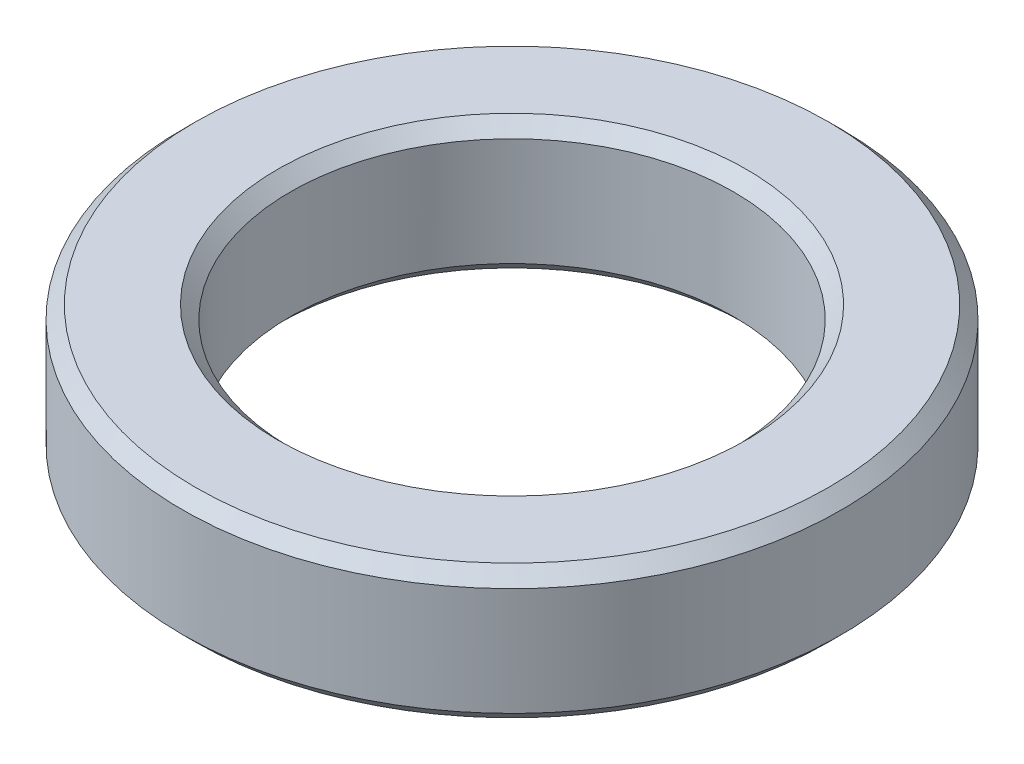
ISO-10303-21;
HEADER;
FILE_DESCRIPTION(('STEP AP214'),'2;1');
FILE_NAME('part.step','',(''),(''),'','','');
FILE_SCHEMA(('AUTOMOTIVE_DESIGN { 1 0 10303 214 1 1 1 1 }'));
ENDSEC;
DATA;
#1=APPLICATION_CONTEXT('core data for automotive mechanical design processes');
#2=APPLICATION_PROTOCOL_DEFINITION('international standard','automotive_design',2000,#1);
#3=PRODUCT_CONTEXT('',#1,'mechanical');
#4=PRODUCT('Part','Part','',(#3));
#5=PRODUCT_RELATED_PRODUCT_CATEGORY('part','',(#4));
#6=PRODUCT_DEFINITION_FORMATION('','',#4);
#7=PRODUCT_DEFINITION_CONTEXT('part definition',#1,'design');
#8=PRODUCT_DEFINITION('design','',#6,#7);
#9=PRODUCT_DEFINITION_SHAPE('','',#8);
#10=(LENGTH_UNIT() NAMED_UNIT(*) SI_UNIT(.MILLI.,.METRE.));
#11=(NAMED_UNIT(*) PLANE_ANGLE_UNIT() SI_UNIT($,.RADIAN.));
#12=(NAMED_UNIT(*) SI_UNIT($,.STERADIAN.) SOLID_ANGLE_UNIT());
#13=UNCERTAINTY_MEASURE_WITH_UNIT(LENGTH_MEASURE(1.E-05),#10,'distance_accuracy_value','');
#14=(GEOMETRIC_REPRESENTATION_CONTEXT(3) GLOBAL_UNCERTAINTY_ASSIGNED_CONTEXT((#13)) GLOBAL_UNIT_ASSIGNED_CONTEXT((#10,
#11,#12)) REPRESENTATION_CONTEXT('',''));
#15=CARTESIAN_POINT('',(0.,0.,0.));
#16=DIRECTION('',(0.,0.,1.));
#17=DIRECTION('',(1.,0.,0.));
#18=AXIS2_PLACEMENT_3D('',#15,#16,#17);
#19=CARTESIAN_POINT('',(0.,6.2,0.));
#20=DIRECTION('',(0.,1.,0.));
#21=DIRECTION('',(0.,0.,1.));
#22=AXIS2_PLACEMENT_3D('',#19,#20,#21);
#23=PLANE('',#22);
#24=CARTESIAN_POINT('',(0.,6.2,0.));
#25=DIRECTION('',(0.,1.,0.));
#26=DIRECTION('',(0.,0.,1.));
#27=AXIS2_PLACEMENT_3D('',#24,#25,#26);
#28=CIRCLE('',#27,10.85);
#29=CARTESIAN_POINT('',(0.,6.2,10.85));
#30=VERTEX_POINT('',#29);
#31=EDGE_CURVE('E10',#30,#30,#28,.F.);
#32=ORIENTED_EDGE('',*,*,#31,.T.);
#33=EDGE_LOOP('',(#32));
#34=FACE_BOUND('',#33,.T.);
#35=CARTESIAN_POINT('',(0.,6.2,0.));
#36=DIRECTION('',(0.,1.,0.));
#37=DIRECTION('',(0.,0.,1.));
#38=AXIS2_PLACEMENT_3D('',#35,#36,#37);
#39=CIRCLE('',#38,14.65);
#40=CARTESIAN_POINT('',(0.,6.2,-14.65));
#41=VERTEX_POINT('',#40);
#42=EDGE_CURVE('E58',#41,#41,#39,.T.);
#43=ORIENTED_EDGE('',*,*,#42,.T.);
#44=EDGE_LOOP('',(#43));
#45=FACE_BOUND('',#44,.T.);
#46=ADVANCED_FACE('F49',(#34,#45),#23,.T.);
#47=CARTESIAN_POINT('',(0.,0.,0.));
#48=DIRECTION('',(0.,1.,0.));
#49=DIRECTION('',(0.,0.,1.));
#50=AXIS2_PLACEMENT_3D('',#47,#48,#49);
#51=PLANE('',#50);
#52=CARTESIAN_POINT('',(0.,0.,0.));
#53=DIRECTION('',(0.,1.,0.));
#54=DIRECTION('',(0.,0.,1.));
#55=AXIS2_PLACEMENT_3D('',#52,#53,#54);
#56=CIRCLE('',#55,10.85);
#57=CARTESIAN_POINT('',(0.,0.,10.85));
#58=VERTEX_POINT('',#57);
#59=EDGE_CURVE('E85',#58,#58,#56,.T.);
#60=ORIENTED_EDGE('',*,*,#59,.T.);
#61=EDGE_LOOP('',(#60));
#62=FACE_BOUND('',#61,.T.);
#63=CARTESIAN_POINT('',(0.,0.,0.));
#64=DIRECTION('',(0.,1.,0.));
#65=DIRECTION('',(0.,0.,1.));
#66=AXIS2_PLACEMENT_3D('',#63,#64,#65);
#67=CIRCLE('',#66,14.65);
#68=CARTESIAN_POINT('',(0.,0.,14.65));
#69=VERTEX_POINT('',#68);
#70=EDGE_CURVE('E88',#69,#69,#67,.F.);
#71=ORIENTED_EDGE('',*,*,#70,.T.);
#72=EDGE_LOOP('',(#71));
#73=FACE_BOUND('',#72,.T.);
#74=ADVANCED_FACE('F94',(#62,#73),#51,.F.);
#75=CARTESIAN_POINT('',(0.,6.2,0.));
#76=DIRECTION('',(0.,-1.,0.));
#77=DIRECTION('',(0.,0.,-1.));
#78=AXIS2_PLACEMENT_3D('',#75,#76,#77);
#79=CYLINDRICAL_SURFACE('',#78,15.25);
#80=CARTESIAN_POINT('',(0.,0.600000000000021,0.));
#81=DIRECTION('',(0.,1.,0.));
#82=DIRECTION('',(0.,0.,1.));
#83=AXIS2_PLACEMENT_3D('',#80,#81,#82);
#84=CIRCLE('',#83,15.25);
#85=CARTESIAN_POINT('',(0.,0.600000000000021,-15.25));
#86=VERTEX_POINT('',#85);
#87=EDGE_CURVE('E66',#86,#86,#84,.T.);
#88=CARTESIAN_POINT('',(0.,5.60000000000003,0.));
#89=DIRECTION('',(0.,1.,0.));
#90=DIRECTION('',(0.,0.,1.));
#91=AXIS2_PLACEMENT_3D('',#88,#89,#90);
#92=CIRCLE('',#91,15.25);
#93=CARTESIAN_POINT('',(0.,5.60000000000003,-15.25));
#94=VERTEX_POINT('',#93);
#95=EDGE_CURVE('E73',#94,#94,#92,.F.);
#96=CARTESIAN_POINT('',(0.,0.600000000000021,-15.25));
#97=CARTESIAN_POINT('',(0.,0.652083333333354,-15.25));
#98=CARTESIAN_POINT('',(0.,0.704166666666687,-15.25));
#99=CARTESIAN_POINT('',(0.,0.808333333333354,-15.25));
#100=CARTESIAN_POINT('',(0.,0.860416666666688,-15.25));
#101=CARTESIAN_POINT('',(0.,0.964583333333355,-15.25));
#102=CARTESIAN_POINT('',(0.,1.01666666666669,-15.25));
#103=CARTESIAN_POINT('',(0.,1.12083333333336,-15.25));
#104=CARTESIAN_POINT('',(0.,1.17291666666669,-15.25));
#105=CARTESIAN_POINT('',(0.,1.27708333333336,-15.25));
#106=CARTESIAN_POINT('',(0.,1.32916666666669,-15.25));
#107=CARTESIAN_POINT('',(0.,1.43333333333336,-15.25));
#108=CARTESIAN_POINT('',(0.,1.48541666666669,-15.25));
#109=CARTESIAN_POINT('',(0.,1.58958333333336,-15.25));
#110=CARTESIAN_POINT('',(0.,1.64166666666669,-15.25));
#111=CARTESIAN_POINT('',(0.,1.74583333333336,-15.25));
#112=CARTESIAN_POINT('',(0.,1.79791666666669,-15.25));
#113=CARTESIAN_POINT('',(0.,1.90208333333336,-15.25));
#114=CARTESIAN_POINT('',(0.,1.95416666666669,-15.25));
#115=CARTESIAN_POINT('',(0.,2.05833333333336,-15.25));
#116=CARTESIAN_POINT('',(0.,2.11041666666669,-15.25));
#117=CARTESIAN_POINT('',(0.,2.21458333333336,-15.25));
#118=CARTESIAN_POINT('',(0.,2.26666666666669,-15.25));
#119=CARTESIAN_POINT('',(0.,2.37083333333336,-15.25));
#120=CARTESIAN_POINT('',(0.,2.42291666666669,-15.25));
#121=CARTESIAN_POINT('',(0.,2.52708333333336,-15.25));
#122=CARTESIAN_POINT('',(0.,2.57916666666669,-15.25));
#123=CARTESIAN_POINT('',(0.,2.68333333333336,-15.25));
#124=CARTESIAN_POINT('',(0.,2.73541666666669,-15.25));
#125=CARTESIAN_POINT('',(0.,2.83958333333336,-15.25));
#126=CARTESIAN_POINT('',(0.,2.89166666666669,-15.25));
#127=CARTESIAN_POINT('',(0.,2.99583333333336,-15.25));
#128=CARTESIAN_POINT('',(0.,3.04791666666669,-15.25));
#129=CARTESIAN_POINT('',(0.,3.15208333333336,-15.25));
#130=CARTESIAN_POINT('',(0.,3.20416666666669,-15.25));
#131=CARTESIAN_POINT('',(0.,3.30833333333336,-15.25));
#132=CARTESIAN_POINT('',(0.,3.3604166666667,-15.25));
#133=CARTESIAN_POINT('',(0.,3.46458333333336,-15.25));
#134=CARTESIAN_POINT('',(0.,3.5166666666667,-15.25));
#135=CARTESIAN_POINT('',(0.,3.62083333333336,-15.25));
#136=CARTESIAN_POINT('',(0.,3.6729166666667,-15.25));
#137=CARTESIAN_POINT('',(0.,3.77708333333336,-15.25));
#138=CARTESIAN_POINT('',(0.,3.8291666666667,-15.25));
#139=CARTESIAN_POINT('',(0.,3.93333333333336,-15.25));
#140=CARTESIAN_POINT('',(0.,3.9854166666667,-15.25));
#141=CARTESIAN_POINT('',(0.,4.08958333333336,-15.25));
#142=CARTESIAN_POINT('',(0.,4.1416666666667,-15.25));
#143=CARTESIAN_POINT('',(0.,4.24583333333336,-15.25));
#144=CARTESIAN_POINT('',(0.,4.2979166666667,-15.25));
#145=CARTESIAN_POINT('',(0.,4.40208333333336,-15.25));
#146=CARTESIAN_POINT('',(0.,4.4541666666667,-15.25));
#147=CARTESIAN_POINT('',(0.,4.55833333333336,-15.25));
#148=CARTESIAN_POINT('',(0.,4.6104166666667,-15.25));
#149=CARTESIAN_POINT('',(0.,4.71458333333337,-15.25));
#150=CARTESIAN_POINT('',(0.,4.7666666666667,-15.25));
#151=CARTESIAN_POINT('',(0.,4.87083333333337,-15.25));
#152=CARTESIAN_POINT('',(0.,4.9229166666667,-15.25));
#153=CARTESIAN_POINT('',(0.,5.02708333333337,-15.25));
#154=CARTESIAN_POINT('',(0.,5.0791666666667,-15.25));
#155=CARTESIAN_POINT('',(0.,5.18333333333337,-15.25));
#156=CARTESIAN_POINT('',(0.,5.2354166666667,-15.25));
#157=CARTESIAN_POINT('',(0.,5.33958333333337,-15.25));
#158=CARTESIAN_POINT('',(0.,5.3916666666667,-15.25));
#159=CARTESIAN_POINT('',(0.,5.49583333333337,-15.25));
#160=CARTESIAN_POINT('',(0.,5.5479166666667,-15.25));
#161=CARTESIAN_POINT('',(0.,5.60000000000003,-15.25));
#162=B_SPLINE_CURVE_WITH_KNOTS('',3,(#96,#97,#98,#99,#100,#101,#102,#103,#104,#105,#106,#107,
#108,#109,#110,#111,#112,#113,#114,#115,#116,#117,#118,#119,#120,#121,#122,#123,#124,#125,#126,
#127,#128,#129,#130,#131,#132,#133,#134,#135,#136,#137,#138,#139,#140,#141,#142,#143,#144,#145,
#146,#147,#148,#149,#150,#151,#152,#153,#154,#155,#156,#157,#158,#159,#160,#161),.UNSPECIFIED.,
.F.,.F.,(4,2,2,2,2,2,2,2,2,2,2,2,2,2,2,2,2,2,2,2,2,2,2,2,2,2,2,2,2,2,2,2,4),(0.,0.15625,
0.312500000000001,0.468750000000001,0.625000000000002,0.781250000000002,0.937500000000003,
1.09375,1.25,1.40625,1.5625,1.71875,1.87500000000001,2.03125000000001,2.18750000000001,
2.34375000000001,2.50000000000001,2.65625000000001,2.81250000000001,2.96875000000001,
3.12500000000001,3.28125000000001,3.43750000000001,3.59375000000001,3.75000000000001,
3.90625000000001,4.06250000000001,4.21875000000001,4.37500000000001,4.53125000000001,
4.68750000000001,4.84375000000001,5.00000000000001),.UNSPECIFIED.);
#163=EDGE_CURVE('BSEAM104',#86,#94,#162,.T.);
#164=ORIENTED_EDGE('',*,*,#87,.T.);
#165=ORIENTED_EDGE('',*,*,#95,.T.);
#166=ORIENTED_EDGE('',*,*,#163,.T.);
#167=ORIENTED_EDGE('',*,*,#163,.F.);
#168=EDGE_LOOP('',(#164,#166,#165,#167));
#169=FACE_BOUND('',#168,.T.);
#170=ADVANCED_FACE('F104',(#169),#79,.T.);
#171=CARTESIAN_POINT('',(0.,6.2,0.));
#172=DIRECTION('',(0.,-1.,0.));
#173=DIRECTION('',(0.,0.,-1.));
#174=AXIS2_PLACEMENT_3D('',#171,#172,#173);
#175=CYLINDRICAL_SURFACE('',#174,10.25);
#176=CARTESIAN_POINT('',(0.,0.599999999999984,0.));
#177=DIRECTION('',(0.,1.,0.));
#178=DIRECTION('',(0.,0.,1.));
#179=AXIS2_PLACEMENT_3D('',#176,#177,#178);
#180=CIRCLE('',#179,10.25);
#181=CARTESIAN_POINT('',(0.,0.599999999999984,-10.25));
#182=VERTEX_POINT('',#181);
#183=EDGE_CURVE('E78',#182,#182,#180,.F.);
#184=CARTESIAN_POINT('',(0.,5.59999999999997,0.));
#185=DIRECTION('',(0.,1.,0.));
#186=DIRECTION('',(0.,0.,1.));
#187=AXIS2_PLACEMENT_3D('',#184,#185,#186);
#188=CIRCLE('',#187,10.25);
#189=CARTESIAN_POINT('',(0.,5.59999999999997,-10.25));
#190=VERTEX_POINT('',#189);
#191=EDGE_CURVE('E82',#190,#190,#188,.T.);
#192=CARTESIAN_POINT('',(0.,0.599999999999984,-10.25));
#193=CARTESIAN_POINT('',(0.,0.652083333333317,-10.25));
#194=CARTESIAN_POINT('',(0.,0.70416666666665,-10.25));
#195=CARTESIAN_POINT('',(0.,0.808333333333317,-10.25));
#196=CARTESIAN_POINT('',(0.,0.86041666666665,-10.25));
#197=CARTESIAN_POINT('',(0.,0.964583333333317,-10.25));
#198=CARTESIAN_POINT('',(0.,1.01666666666665,-10.25));
#199=CARTESIAN_POINT('',(0.,1.12083333333332,-10.25));
#200=CARTESIAN_POINT('',(0.,1.17291666666665,-10.25));
#201=CARTESIAN_POINT('',(0.,1.27708333333332,-10.25));
#202=CARTESIAN_POINT('',(0.,1.32916666666665,-10.25));
#203=CARTESIAN_POINT('',(0.,1.43333333333332,-10.25));
#204=CARTESIAN_POINT('',(0.,1.48541666666665,-10.25));
#205=CARTESIAN_POINT('',(0.,1.58958333333332,-10.25));
#206=CARTESIAN_POINT('',(0.,1.64166666666665,-10.25));
#207=CARTESIAN_POINT('',(0.,1.74583333333331,-10.25));
#208=CARTESIAN_POINT('',(0.,1.79791666666665,-10.25));
#209=CARTESIAN_POINT('',(0.,1.90208333333331,-10.25));
#210=CARTESIAN_POINT('',(0.,1.95416666666665,-10.25));
#211=CARTESIAN_POINT('',(0.,2.05833333333331,-10.25));
#212=CARTESIAN_POINT('',(0.,2.11041666666665,-10.25));
#213=CARTESIAN_POINT('',(0.,2.21458333333331,-10.25));
#214=CARTESIAN_POINT('',(0.,2.26666666666665,-10.25));
#215=CARTESIAN_POINT('',(0.,2.37083333333331,-10.25));
#216=CARTESIAN_POINT('',(0.,2.42291666666665,-10.25));
#217=CARTESIAN_POINT('',(0.,2.52708333333331,-10.25));
#218=CARTESIAN_POINT('',(0.,2.57916666666665,-10.25));
#219=CARTESIAN_POINT('',(0.,2.68333333333331,-10.25));
#220=CARTESIAN_POINT('',(0.,2.73541666666664,-10.25));
#221=CARTESIAN_POINT('',(0.,2.83958333333331,-10.25));
#222=CARTESIAN_POINT('',(0.,2.89166666666664,-10.25));
#223=CARTESIAN_POINT('',(0.,2.99583333333331,-10.25));
#224=CARTESIAN_POINT('',(0.,3.04791666666664,-10.25));
#225=CARTESIAN_POINT('',(0.,3.15208333333331,-10.25));
#226=CARTESIAN_POINT('',(0.,3.20416666666664,-10.25));
#227=CARTESIAN_POINT('',(0.,3.30833333333331,-10.25));
#228=CARTESIAN_POINT('',(0.,3.36041666666664,-10.25));
#229=CARTESIAN_POINT('',(0.,3.46458333333331,-10.25));
#230=CARTESIAN_POINT('',(0.,3.51666666666664,-10.25));
#231=CARTESIAN_POINT('',(0.,3.62083333333331,-10.25));
#232=CARTESIAN_POINT('',(0.,3.67291666666664,-10.25));
#233=CARTESIAN_POINT('',(0.,3.77708333333331,-10.25));
#234=CARTESIAN_POINT('',(0.,3.82916666666664,-10.25));
#235=CARTESIAN_POINT('',(0.,3.93333333333331,-10.25));
#236=CARTESIAN_POINT('',(0.,3.98541666666664,-10.25));
#237=CARTESIAN_POINT('',(0.,4.08958333333331,-10.25));
#238=CARTESIAN_POINT('',(0.,4.14166666666664,-10.25));
#239=CARTESIAN_POINT('',(0.,4.24583333333331,-10.25));
#240=CARTESIAN_POINT('',(0.,4.29791666666664,-10.25));
#241=CARTESIAN_POINT('',(0.,4.40208333333331,-10.25));
#242=CARTESIAN_POINT('',(0.,4.45416666666664,-10.25));
#243=CARTESIAN_POINT('',(0.,4.55833333333331,-10.25));
#244=CARTESIAN_POINT('',(0.,4.61041666666664,-10.25));
#245=CARTESIAN_POINT('',(0.,4.71458333333331,-10.25));
#246=CARTESIAN_POINT('',(0.,4.76666666666664,-10.25));
#247=CARTESIAN_POINT('',(0.,4.87083333333331,-10.25));
#248=CARTESIAN_POINT('',(0.,4.92291666666664,-10.25));
#249=CARTESIAN_POINT('',(0.,5.02708333333331,-10.25));
#250=CARTESIAN_POINT('',(0.,5.07916666666664,-10.25));
#251=CARTESIAN_POINT('',(0.,5.1833333333333,-10.25));
#252=CARTESIAN_POINT('',(0.,5.23541666666664,-10.25));
#253=CARTESIAN_POINT('',(0.,5.33958333333331,-10.25));
#254=CARTESIAN_POINT('',(0.,5.39166666666664,-10.25));
#255=CARTESIAN_POINT('',(0.,5.4958333333333,-10.25));
#256=CARTESIAN_POINT('',(0.,5.54791666666664,-10.25));
#257=CARTESIAN_POINT('',(0.,5.59999999999997,-10.25));
#258=B_SPLINE_CURVE_WITH_KNOTS('',3,(#192,#193,#194,#195,#196,#197,#198,#199,#200,#201,#202,
#203,#204,#205,#206,#207,#208,#209,#210,#211,#212,#213,#214,#215,#216,#217,#218,#219,#220,#221,
#222,#223,#224,#225,#226,#227,#228,#229,#230,#231,#232,#233,#234,#235,#236,#237,#238,#239,#240,
#241,#242,#243,#244,#245,#246,#247,#248,#249,#250,#251,#252,#253,#254,#255,#256,#257),
.UNSPECIFIED.,.F.,.F.,(4,2,2,2,2,2,2,2,2,2,2,2,2,2,2,2,2,2,2,2,2,2,2,2,2,2,2,2,2,2,2,2,4),(0.,
0.156249999999999,0.312499999999999,0.468749999999999,0.624999999999999,0.781249999999998,
0.937499999999997,1.09375,1.25,1.40625,1.5625,1.71875,1.87499999999999,2.03124999999999,
2.18749999999999,2.34374999999999,2.49999999999999,2.65624999999999,2.81249999999999,
2.96874999999999,3.12499999999999,3.28124999999999,3.43749999999999,3.59374999999999,
3.74999999999999,3.90624999999999,4.06249999999999,4.21874999999999,4.37499999999999,
4.53124999999999,4.68749999999999,4.84374999999999,4.99999999999999),.UNSPECIFIED.);
#259=EDGE_CURVE('BSEAM107',#182,#190,#258,.T.);
#260=ORIENTED_EDGE('',*,*,#183,.T.);
#261=ORIENTED_EDGE('',*,*,#191,.T.);
#262=ORIENTED_EDGE('',*,*,#259,.T.);
#263=ORIENTED_EDGE('',*,*,#259,.F.);
#264=EDGE_LOOP('',(#260,#262,#261,#263));
#265=FACE_BOUND('',#264,.T.);
#266=ADVANCED_FACE('F107',(#265),#175,.F.);
#267=CARTESIAN_POINT('',(0.,0.,0.));
#268=DIRECTION('',(0.,-1.,0.));
#269=DIRECTION('',(0.,0.,-1.));
#270=AXIS2_PLACEMENT_3D('',#267,#268,#269);
#271=CONICAL_SURFACE('',#270,10.85,0.785398163397447);
#272=ORIENTED_EDGE('',*,*,#183,.F.);
#273=EDGE_LOOP('',(#272));
#274=FACE_BOUND('',#273,.T.);
#275=ORIENTED_EDGE('',*,*,#59,.F.);
#276=EDGE_LOOP('',(#275));
#277=FACE_BOUND('',#276,.T.);
#278=ADVANCED_FACE('F100',(#274,#277),#271,.F.);
#279=CARTESIAN_POINT('',(0.,0.600000000000021,0.));
#280=DIRECTION('',(0.,1.,0.));
#281=DIRECTION('',(0.,0.,1.));
#282=AXIS2_PLACEMENT_3D('',#279,#280,#281);
#283=CONICAL_SURFACE('',#282,15.25,0.785398163397448);
#284=ORIENTED_EDGE('',*,*,#70,.F.);
#285=EDGE_LOOP('',(#284));
#286=FACE_BOUND('',#285,.T.);
#287=ORIENTED_EDGE('',*,*,#87,.F.);
#288=EDGE_LOOP('',(#287));
#289=FACE_BOUND('',#288,.T.);
#290=ADVANCED_FACE('F96',(#286,#289),#283,.T.);
#291=CARTESIAN_POINT('',(0.,5.59999999999997,0.));
#292=DIRECTION('',(0.,1.,0.));
#293=DIRECTION('',(0.,0.,1.));
#294=AXIS2_PLACEMENT_3D('',#291,#292,#293);
#295=CONICAL_SURFACE('',#294,10.25,0.785398163397447);
#296=ORIENTED_EDGE('',*,*,#31,.F.);
#297=EDGE_LOOP('',(#296));
#298=FACE_BOUND('',#297,.T.);
#299=ORIENTED_EDGE('',*,*,#191,.F.);
#300=EDGE_LOOP('',(#299));
#301=FACE_BOUND('',#300,.T.);
#302=ADVANCED_FACE('F99',(#298,#301),#295,.F.);
#303=CARTESIAN_POINT('',(0.,6.2,0.));
#304=DIRECTION('',(0.,-1.,0.));
#305=DIRECTION('',(0.,0.,-1.));
#306=AXIS2_PLACEMENT_3D('',#303,#304,#305);
#307=CONICAL_SURFACE('',#306,14.65,0.785398163397441);
#308=CARTESIAN_POINT('',(0.,5.60000000000003,-15.25));
#309=CARTESIAN_POINT('',(0.,5.60625000000003,-15.24375));
#310=CARTESIAN_POINT('',(0.,5.61250000000003,-15.2375));
#311=CARTESIAN_POINT('',(0.,5.62500000000003,-15.225));
#312=CARTESIAN_POINT('',(0.,5.63125000000003,-15.21875));
#313=CARTESIAN_POINT('',(0.,5.64375000000003,-15.20625));
#314=CARTESIAN_POINT('',(0.,5.65000000000003,-15.2));
#315=CARTESIAN_POINT('',(0.,5.66250000000003,-15.1875));
#316=CARTESIAN_POINT('',(0.,5.66875000000003,-15.18125));
#317=CARTESIAN_POINT('',(0.,5.68125000000003,-15.16875));
#318=CARTESIAN_POINT('',(0.,5.68750000000003,-15.1625));
#319=CARTESIAN_POINT('',(0.,5.70000000000003,-15.15));
#320=CARTESIAN_POINT('',(0.,5.70625000000003,-15.14375));
#321=CARTESIAN_POINT('',(0.,5.71875000000003,-15.13125));
#322=CARTESIAN_POINT('',(0.,5.72500000000003,-15.125));
#323=CARTESIAN_POINT('',(0.,5.73750000000003,-15.1125));
#324=CARTESIAN_POINT('',(0.,5.74375000000003,-15.10625));
#325=CARTESIAN_POINT('',(0.,5.75625000000003,-15.09375));
#326=CARTESIAN_POINT('',(0.,5.76250000000003,-15.0875));
#327=CARTESIAN_POINT('',(0.,5.77500000000002,-15.075));
#328=CARTESIAN_POINT('',(0.,5.78125000000002,-15.06875));
#329=CARTESIAN_POINT('',(0.,5.79375000000002,-15.05625));
#330=CARTESIAN_POINT('',(0.,5.80000000000002,-15.05));
#331=CARTESIAN_POINT('',(0.,5.81250000000002,-15.0375));
#332=CARTESIAN_POINT('',(0.,5.81875000000002,-15.03125));
#333=CARTESIAN_POINT('',(0.,5.83125000000002,-15.01875));
#334=CARTESIAN_POINT('',(0.,5.83750000000002,-15.0125));
#335=CARTESIAN_POINT('',(0.,5.85000000000002,-15.));
#336=CARTESIAN_POINT('',(0.,5.85625000000002,-14.99375));
#337=CARTESIAN_POINT('',(0.,5.86875000000002,-14.98125));
#338=CARTESIAN_POINT('',(0.,5.87500000000002,-14.975));
#339=CARTESIAN_POINT('',(0.,5.88750000000002,-14.9625));
#340=CARTESIAN_POINT('',(0.,5.89375000000002,-14.95625));
#341=CARTESIAN_POINT('',(0.,5.90625000000002,-14.94375));
#342=CARTESIAN_POINT('',(0.,5.91250000000002,-14.9375));
#343=CARTESIAN_POINT('',(0.,5.92500000000001,-14.925));
#344=CARTESIAN_POINT('',(0.,5.93125000000002,-14.91875));
#345=CARTESIAN_POINT('',(0.,5.94375000000001,-14.90625));
#346=CARTESIAN_POINT('',(0.,5.95000000000001,-14.9));
#347=CARTESIAN_POINT('',(0.,5.96250000000001,-14.8875));
#348=CARTESIAN_POINT('',(0.,5.96875000000001,-14.88125));
#349=CARTESIAN_POINT('',(0.,5.98125000000001,-14.86875));
#350=CARTESIAN_POINT('',(0.,5.98750000000001,-14.8625));
#351=CARTESIAN_POINT('',(0.,6.00000000000001,-14.85));
#352=CARTESIAN_POINT('',(0.,6.00625000000001,-14.84375));
#353=CARTESIAN_POINT('',(0.,6.01875000000001,-14.83125));
#354=CARTESIAN_POINT('',(0.,6.02500000000001,-14.825));
#355=CARTESIAN_POINT('',(0.,6.03750000000001,-14.8125));
#356=CARTESIAN_POINT('',(0.,6.04375000000001,-14.80625));
#357=CARTESIAN_POINT('',(0.,6.05625000000001,-14.79375));
#358=CARTESIAN_POINT('',(0.,6.06250000000001,-14.7875));
#359=CARTESIAN_POINT('',(0.,6.07500000000001,-14.775));
#360=CARTESIAN_POINT('',(0.,6.08125000000001,-14.76875));
#361=CARTESIAN_POINT('',(0.,6.09375000000001,-14.75625));
#362=CARTESIAN_POINT('',(0.,6.1,-14.75));
#363=CARTESIAN_POINT('',(0.,6.1125,-14.7375));
#364=CARTESIAN_POINT('',(0.,6.11875,-14.73125));
#365=CARTESIAN_POINT('',(0.,6.13125,-14.71875));
#366=CARTESIAN_POINT('',(0.,6.1375,-14.7125));
#367=CARTESIAN_POINT('',(0.,6.15,-14.7));
#368=CARTESIAN_POINT('',(0.,6.15625,-14.69375));
#369=CARTESIAN_POINT('',(0.,6.16875,-14.68125));
#370=CARTESIAN_POINT('',(0.,6.175,-14.675));
#371=CARTESIAN_POINT('',(0.,6.1875,-14.6625));
#372=CARTESIAN_POINT('',(0.,6.19375,-14.65625));
#373=CARTESIAN_POINT('',(0.,6.2,-14.65));
#374=B_SPLINE_CURVE_WITH_KNOTS('',3,(#308,#309,#310,#311,#312,#313,#314,#315,#316,#317,#318,
#319,#320,#321,#322,#323,#324,#325,#326,#327,#328,#329,#330,#331,#332,#333,#334,#335,#336,#337,
#338,#339,#340,#341,#342,#343,#344,#345,#346,#347,#348,#349,#350,#351,#352,#353,#354,#355,#356,
#357,#358,#359,#360,#361,#362,#363,#364,#365,#366,#367,#368,#369,#370,#371,#372,#373),
.UNSPECIFIED.,.F.,.F.,(4,2,2,2,2,2,2,2,2,2,2,2,2,2,2,2,2,2,2,2,2,2,2,2,2,2,2,2,2,2,2,2,4),(0.,
0.0265165042944932,0.0530330085889877,0.0795495128834809,0.106066017177974,0.132582521472469,
0.159099025766962,0.185615530061456,0.21213203435595,0.238648538650443,0.265165042944938,
0.291681547239431,0.318198051533925,0.344714555828419,0.371231060122912,0.397747564417406,
0.4242640687119,0.450780573006395,0.477297077300888,0.503813581595381,0.530330085889876,
0.556846590184369,0.583363094478863,0.609879598773356,0.636396103067851,0.662912607362345,
0.689429111656838,0.715945615951332,0.742462120245825,0.76897862454032,0.795495128834813,
0.822011633129306,0.848528137423801),.UNSPECIFIED.);
#375=EDGE_CURVE('BSEAM52',#94,#41,#374,.T.);
#376=ORIENTED_EDGE('',*,*,#95,.F.);
#377=ORIENTED_EDGE('',*,*,#42,.F.);
#378=ORIENTED_EDGE('',*,*,#375,.T.);
#379=ORIENTED_EDGE('',*,*,#375,.F.);
#380=EDGE_LOOP('',(#376,#378,#377,#379));
#381=FACE_BOUND('',#380,.T.);
#382=ADVANCED_FACE('F52',(#381),#307,.T.);
#383=CLOSED_SHELL('',(#46,#74,#170,#266,#278,#290,#302,#382));
#384=MANIFOLD_SOLID_BREP('B2',#383);
#385=ADVANCED_BREP_SHAPE_REPRESENTATION('',(#18,#384),#14);
#386=SHAPE_DEFINITION_REPRESENTATION(#9,#385);
ENDSEC;
END-ISO-10303-21;
